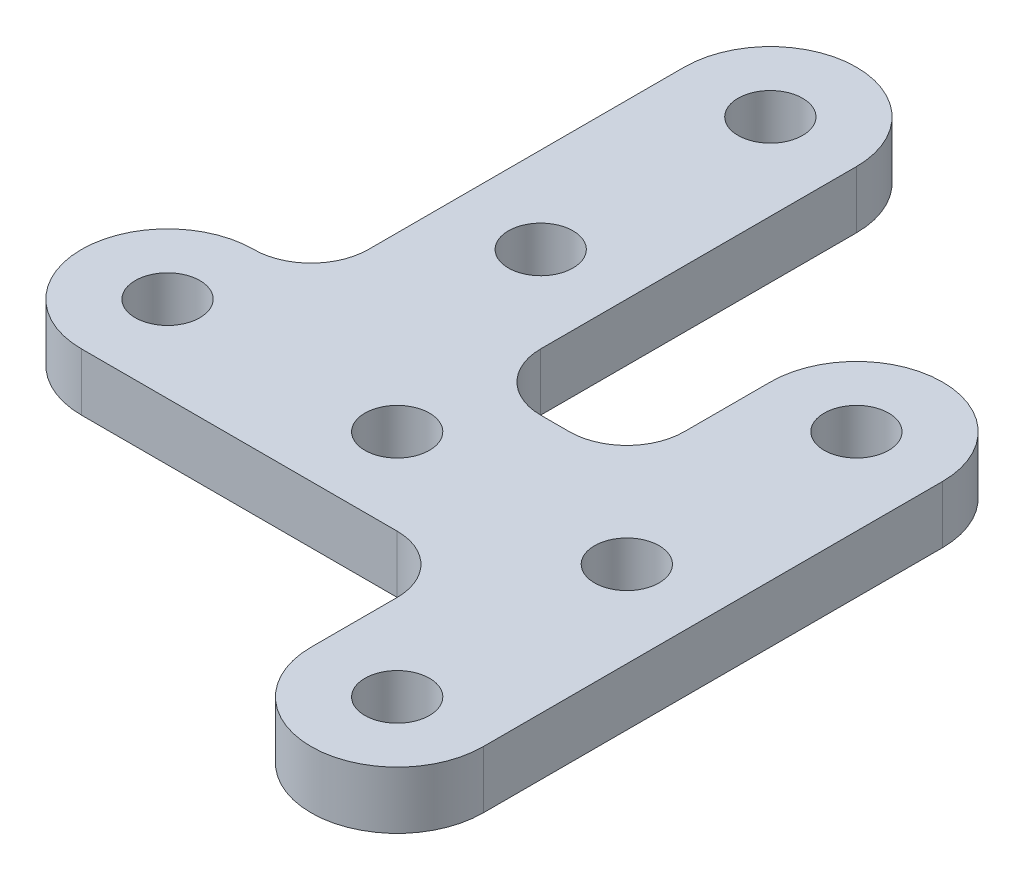
ISO-10303-21;
HEADER;
FILE_DESCRIPTION(('STEP AP214'),'2;1');
FILE_NAME('part.step','',(''),(''),'','','');
FILE_SCHEMA(('AUTOMOTIVE_DESIGN { 1 0 10303 214 1 1 1 1 }'));
ENDSEC;
DATA;
#1=APPLICATION_CONTEXT('core data for automotive mechanical design processes');
#2=APPLICATION_PROTOCOL_DEFINITION('international standard','automotive_design',2000,#1);
#3=PRODUCT_CONTEXT('',#1,'mechanical');
#4=PRODUCT('Part','Part','',(#3));
#5=PRODUCT_RELATED_PRODUCT_CATEGORY('part','',(#4));
#6=PRODUCT_DEFINITION_FORMATION('','',#4);
#7=PRODUCT_DEFINITION_CONTEXT('part definition',#1,'design');
#8=PRODUCT_DEFINITION('design','',#6,#7);
#9=PRODUCT_DEFINITION_SHAPE('','',#8);
#10=(LENGTH_UNIT() NAMED_UNIT(*) SI_UNIT(.MILLI.,.METRE.));
#11=(NAMED_UNIT(*) PLANE_ANGLE_UNIT() SI_UNIT($,.RADIAN.));
#12=(NAMED_UNIT(*) SI_UNIT($,.STERADIAN.) SOLID_ANGLE_UNIT());
#13=UNCERTAINTY_MEASURE_WITH_UNIT(LENGTH_MEASURE(1.E-05),#10,'distance_accuracy_value','');
#14=(GEOMETRIC_REPRESENTATION_CONTEXT(3) GLOBAL_UNCERTAINTY_ASSIGNED_CONTEXT((#13)) GLOBAL_UNIT_ASSIGNED_CONTEXT((#10,
#11,#12)) REPRESENTATION_CONTEXT('',''));
#15=CARTESIAN_POINT('',(0.,0.,0.));
#16=DIRECTION('',(0.,0.,1.));
#17=DIRECTION('',(1.,0.,0.));
#18=AXIS2_PLACEMENT_3D('',#15,#16,#17);
#19=CARTESIAN_POINT('',(89.566812484,125.727574554,1318.950334154));
#20=DIRECTION('',(0.,0.,1.));
#21=DIRECTION('',(1.,0.,0.));
#22=AXIS2_PLACEMENT_3D('',#19,#20,#21);
#23=PLANE('',#22);
#24=DIRECTION('',(1.,0.,0.));
#25=VECTOR('',#24,1.);
#26=CARTESIAN_POINT('',(89.566812484,132.077574554,1318.950334154));
#27=LINE('',#26,#25);
#28=CARTESIAN_POINT('',(95.9168124839999,132.077574554,1318.950334154));
#29=VERTEX_POINT('',#28);
#30=CARTESIAN_POINT('',(99.0918124839999,132.077574554,1318.950334154));
#31=VERTEX_POINT('',#30);
#32=EDGE_CURVE('E193',#29,#31,#27,.T.);
#33=ORIENTED_EDGE('',*,*,#32,.T.);
#34=DIRECTION('',(0.,1.,0.));
#35=VECTOR('',#34,1.);
#36=CARTESIAN_POINT('',(99.0918124839999,125.727574554,1318.950334154));
#37=LINE('',#36,#35);
#38=CARTESIAN_POINT('',(99.0918124839999,125.727574554,1318.950334154));
#39=VERTEX_POINT('',#38);
#40=EDGE_CURVE('E248',#31,#39,#37,.F.);
#41=ORIENTED_EDGE('',*,*,#40,.T.);
#42=DIRECTION('',(1.,0.,0.));
#43=VECTOR('',#42,1.);
#44=CARTESIAN_POINT('',(89.566812484,125.727574554,1318.950334154));
#45=LINE('',#44,#43);
#46=CARTESIAN_POINT('',(95.9168124839999,125.727574554,1318.950334154));
#47=VERTEX_POINT('',#46);
#48=EDGE_CURVE('E157',#47,#39,#45,.T.);
#49=ORIENTED_EDGE('',*,*,#48,.F.);
#50=DIRECTION('',(0.,1.,0.));
#51=VECTOR('',#50,1.);
#52=CARTESIAN_POINT('',(95.9168124839999,132.077574554,1318.950334154));
#53=LINE('',#52,#51);
#54=EDGE_CURVE('E245',#47,#29,#53,.T.);
#55=ORIENTED_EDGE('',*,*,#54,.T.);
#56=EDGE_LOOP('',(#33,#41,#49,#55));
#57=FACE_BOUND('',#56,.T.);
#58=ADVANCED_FACE('F39',(#57),#23,.F.);
#59=CARTESIAN_POINT('',(105.441812484,125.727574554,1318.950334154));
#60=DIRECTION('',(1.,0.,0.));
#61=DIRECTION('',(0.,0.,-1.));
#62=AXIS2_PLACEMENT_3D('',#59,#60,#61);
#63=PLANE('',#62);
#64=DIRECTION('',(0.,0.,-1.));
#65=VECTOR('',#64,1.);
#66=CARTESIAN_POINT('',(105.441812484,125.727574554,1318.950334154));
#67=LINE('',#66,#65);
#68=CARTESIAN_POINT('',(105.441812484,125.727574554,1312.600334154));
#69=VERTEX_POINT('',#68);
#70=CARTESIAN_POINT('',(105.441812484,125.727574554,1303.075334154));
#71=VERTEX_POINT('',#70);
#72=EDGE_CURVE('E145',#69,#71,#67,.T.);
#73=ORIENTED_EDGE('',*,*,#72,.F.);
#74=DIRECTION('',(0.,1.,0.));
#75=VECTOR('',#74,1.);
#76=CARTESIAN_POINT('',(105.441812484,132.077574554,1312.600334154));
#77=LINE('',#76,#75);
#78=CARTESIAN_POINT('',(105.441812484,132.077574554,1312.600334154));
#79=VERTEX_POINT('',#78);
#80=EDGE_CURVE('E243',#69,#79,#77,.T.);
#81=ORIENTED_EDGE('',*,*,#80,.T.);
#82=DIRECTION('',(0.,0.,-1.));
#83=VECTOR('',#82,1.);
#84=CARTESIAN_POINT('',(105.441812484,132.077574554,1318.950334154));
#85=LINE('',#84,#83);
#86=CARTESIAN_POINT('',(105.441812484,132.077574554,1303.075334154));
#87=VERTEX_POINT('',#86);
#88=EDGE_CURVE('E163',#79,#87,#85,.T.);
#89=ORIENTED_EDGE('',*,*,#88,.T.);
#90=DIRECTION('',(0.,1.,0.));
#91=VECTOR('',#90,1.);
#92=CARTESIAN_POINT('',(105.441812484,125.727574554,1303.075334154));
#93=LINE('',#92,#91);
#94=EDGE_CURVE('E160',#71,#87,#93,.T.);
#95=ORIENTED_EDGE('',*,*,#94,.F.);
#96=EDGE_LOOP('',(#73,#81,#89,#95));
#97=FACE_BOUND('',#96,.T.);
#98=ADVANCED_FACE('F161',(#97),#63,.F.);
#99=CARTESIAN_POINT('',(114.966812484,125.727574554,1303.075334154));
#100=DIRECTION('',(0.,1.,0.));
#101=DIRECTION('',(0.,0.,1.));
#102=AXIS2_PLACEMENT_3D('',#99,#100,#101);
#103=CYLINDRICAL_SURFACE('',#102,9.52500000000004);
#104=CARTESIAN_POINT('',(114.966812484,132.077574554,1303.075334154));
#105=DIRECTION('',(0.,-1.,0.));
#106=DIRECTION('',(0.,0.,-1.));
#107=AXIS2_PLACEMENT_3D('',#104,#105,#106);
#108=CIRCLE('',#107,9.52500000000004);
#109=CARTESIAN_POINT('',(124.491812484,132.077574554,1303.075334154));
#110=VERTEX_POINT('',#109);
#111=EDGE_CURVE('E198',#87,#110,#108,.T.);
#112=ORIENTED_EDGE('',*,*,#111,.T.);
#113=DIRECTION('',(0.,1.,0.));
#114=VECTOR('',#113,1.);
#115=CARTESIAN_POINT('',(124.491812484,125.727574554,1303.075334154));
#116=LINE('',#115,#114);
#117=CARTESIAN_POINT('',(124.491812484,125.727574554,1303.075334154));
#118=VERTEX_POINT('',#117);
#119=EDGE_CURVE('E167',#118,#110,#116,.T.);
#120=ORIENTED_EDGE('',*,*,#119,.F.);
#121=CARTESIAN_POINT('',(114.966812484,125.727574554,1303.075334154));
#122=DIRECTION('',(0.,-1.,0.));
#123=DIRECTION('',(0.,0.,-1.));
#124=AXIS2_PLACEMENT_3D('',#121,#122,#123);
#125=CIRCLE('',#124,9.52500000000004);
#126=EDGE_CURVE('E149',#71,#118,#125,.T.);
#127=ORIENTED_EDGE('',*,*,#126,.F.);
#128=ORIENTED_EDGE('',*,*,#94,.T.);
#129=EDGE_LOOP('',(#112,#120,#127,#128));
#130=FACE_BOUND('',#129,.T.);
#131=ADVANCED_FACE('F169',(#130),#103,.T.);
#132=CARTESIAN_POINT('',(124.491812484,125.727574554,1303.075334154));
#133=DIRECTION('',(-1.,0.,0.));
#134=DIRECTION('',(0.,0.,1.));
#135=AXIS2_PLACEMENT_3D('',#132,#133,#134);
#136=PLANE('',#135);
#137=DIRECTION('',(0.,0.,1.));
#138=VECTOR('',#137,1.);
#139=CARTESIAN_POINT('',(124.491812484,132.077574554,1303.075334154));
#140=LINE('',#139,#138);
#141=CARTESIAN_POINT('',(124.491812484,132.077574554,1353.875334154));
#142=VERTEX_POINT('',#141);
#143=EDGE_CURVE('E200',#110,#142,#140,.T.);
#144=ORIENTED_EDGE('',*,*,#143,.T.);
#145=DIRECTION('',(0.,1.,0.));
#146=VECTOR('',#145,1.);
#147=CARTESIAN_POINT('',(124.491812484,125.727574554,1353.875334154));
#148=LINE('',#147,#146);
#149=CARTESIAN_POINT('',(124.491812484,125.727574554,1353.875334154));
#150=VERTEX_POINT('',#149);
#151=EDGE_CURVE('E232',#150,#142,#148,.T.);
#152=ORIENTED_EDGE('',*,*,#151,.F.);
#153=DIRECTION('',(0.,0.,1.));
#154=VECTOR('',#153,1.);
#155=CARTESIAN_POINT('',(124.491812484,125.727574554,1303.075334154));
#156=LINE('',#155,#154);
#157=EDGE_CURVE('E172',#118,#150,#156,.T.);
#158=ORIENTED_EDGE('',*,*,#157,.F.);
#159=ORIENTED_EDGE('',*,*,#119,.T.);
#160=EDGE_LOOP('',(#144,#152,#158,#159));
#161=FACE_BOUND('',#160,.T.);
#162=ADVANCED_FACE('F335',(#161),#136,.F.);
#163=CARTESIAN_POINT('',(114.966812484,125.727574554,1353.875334154));
#164=DIRECTION('',(0.,1.,0.));
#165=DIRECTION('',(0.,0.,1.));
#166=AXIS2_PLACEMENT_3D('',#163,#164,#165);
#167=CYLINDRICAL_SURFACE('',#166,9.52500000000003);
#168=CARTESIAN_POINT('',(114.966812484,132.077574554,1353.875334154));
#169=DIRECTION('',(0.,-1.,0.));
#170=DIRECTION('',(0.,0.,-1.));
#171=AXIS2_PLACEMENT_3D('',#168,#169,#170);
#172=CIRCLE('',#171,9.52500000000003);
#173=CARTESIAN_POINT('',(105.441812484,132.077574554,1353.875334154));
#174=VERTEX_POINT('',#173);
#175=EDGE_CURVE('E202',#142,#174,#172,.T.);
#176=ORIENTED_EDGE('',*,*,#175,.T.);
#177=DIRECTION('',(0.,1.,0.));
#178=VECTOR('',#177,1.);
#179=CARTESIAN_POINT('',(105.441812484,125.727574554,1353.875334154));
#180=LINE('',#179,#178);
#181=CARTESIAN_POINT('',(105.441812484,125.727574554,1353.875334154));
#182=VERTEX_POINT('',#181);
#183=EDGE_CURVE('E229',#182,#174,#180,.T.);
#184=ORIENTED_EDGE('',*,*,#183,.F.);
#185=CARTESIAN_POINT('',(114.966812484,125.727574554,1353.875334154));
#186=DIRECTION('',(0.,-1.,0.));
#187=DIRECTION('',(0.,0.,-1.));
#188=AXIS2_PLACEMENT_3D('',#185,#186,#187);
#189=CIRCLE('',#188,9.52500000000003);
#190=EDGE_CURVE('E174',#150,#182,#189,.T.);
#191=ORIENTED_EDGE('',*,*,#190,.F.);
#192=ORIENTED_EDGE('',*,*,#151,.T.);
#193=EDGE_LOOP('',(#176,#184,#191,#192));
#194=FACE_BOUND('',#193,.T.);
#195=ADVANCED_FACE('F332',(#194),#167,.T.);
#196=CARTESIAN_POINT('',(105.441812484,125.727574554,1338.000334154));
#197=DIRECTION('',(1.,0.,0.));
#198=DIRECTION('',(0.,0.,-1.));
#199=AXIS2_PLACEMENT_3D('',#196,#197,#198);
#200=PLANE('',#199);
#201=DIRECTION('',(0.,0.,-1.));
#202=VECTOR('',#201,1.);
#203=CARTESIAN_POINT('',(105.441812484,132.077574554,1338.000334154));
#204=LINE('',#203,#202);
#205=CARTESIAN_POINT('',(105.441812484,132.077574554,1344.350334154));
#206=VERTEX_POINT('',#205);
#207=EDGE_CURVE('E204',#174,#206,#204,.T.);
#208=ORIENTED_EDGE('',*,*,#207,.T.);
#209=DIRECTION('',(0.,1.,0.));
#210=VECTOR('',#209,1.);
#211=CARTESIAN_POINT('',(105.441812484,125.727574554,1344.350334154));
#212=LINE('',#211,#210);
#213=CARTESIAN_POINT('',(105.441812484,125.727574554,1344.350334154));
#214=VERTEX_POINT('',#213);
#215=EDGE_CURVE('E241',#206,#214,#212,.F.);
#216=ORIENTED_EDGE('',*,*,#215,.T.);
#217=DIRECTION('',(0.,0.,-1.));
#218=VECTOR('',#217,1.);
#219=CARTESIAN_POINT('',(105.441812484,125.727574554,1338.000334154));
#220=LINE('',#219,#218);
#221=EDGE_CURVE('E179',#182,#214,#220,.T.);
#222=ORIENTED_EDGE('',*,*,#221,.F.);
#223=ORIENTED_EDGE('',*,*,#183,.T.);
#224=EDGE_LOOP('',(#208,#216,#222,#223));
#225=FACE_BOUND('',#224,.T.);
#226=ADVANCED_FACE('F325',(#225),#200,.F.);
#227=CARTESIAN_POINT('',(64.1668124839999,125.727574554,1338.000334154));
#228=DIRECTION('',(0.,0.,-1.));
#229=DIRECTION('',(-1.,0.,0.));
#230=AXIS2_PLACEMENT_3D('',#227,#228,#229);
#231=PLANE('',#230);
#232=DIRECTION('',(-1.,0.,0.));
#233=VECTOR('',#232,1.);
#234=CARTESIAN_POINT('',(64.1668124839999,125.727574554,1338.000334154));
#235=LINE('',#234,#233);
#236=CARTESIAN_POINT('',(99.0918124839999,125.727574554,1338.000334154));
#237=VERTEX_POINT('',#236);
#238=CARTESIAN_POINT('',(64.1668124839999,125.727574554,1338.000334154));
#239=VERTEX_POINT('',#238);
#240=EDGE_CURVE('E182',#237,#239,#235,.T.);
#241=ORIENTED_EDGE('',*,*,#240,.F.);
#242=DIRECTION('',(0.,1.,0.));
#243=VECTOR('',#242,1.);
#244=CARTESIAN_POINT('',(99.0918124839999,132.077574554,1338.000334154));
#245=LINE('',#244,#243);
#246=CARTESIAN_POINT('',(99.0918124839999,132.077574554,1338.000334154));
#247=VERTEX_POINT('',#246);
#248=EDGE_CURVE('E238',#237,#247,#245,.T.);
#249=ORIENTED_EDGE('',*,*,#248,.T.);
#250=DIRECTION('',(-1.,0.,0.));
#251=VECTOR('',#250,1.);
#252=CARTESIAN_POINT('',(64.1668124839999,132.077574554,1338.000334154));
#253=LINE('',#252,#251);
#254=CARTESIAN_POINT('',(64.1668124839999,132.077574554,1338.000334154));
#255=VERTEX_POINT('',#254);
#256=EDGE_CURVE('E207',#247,#255,#253,.T.);
#257=ORIENTED_EDGE('',*,*,#256,.T.);
#258=DIRECTION('',(0.,1.,0.));
#259=VECTOR('',#258,1.);
#260=CARTESIAN_POINT('',(64.1668124839999,125.727574554,1338.000334154));
#261=LINE('',#260,#259);
#262=EDGE_CURVE('E226',#239,#255,#261,.T.);
#263=ORIENTED_EDGE('',*,*,#262,.F.);
#264=EDGE_LOOP('',(#241,#249,#257,#263));
#265=FACE_BOUND('',#264,.T.);
#266=ADVANCED_FACE('F319',(#265),#231,.F.);
#267=CARTESIAN_POINT('',(64.1668124839999,125.727574554,1328.475334154));
#268=DIRECTION('',(0.,1.,0.));
#269=DIRECTION('',(0.,0.,1.));
#270=AXIS2_PLACEMENT_3D('',#267,#268,#269);
#271=CYLINDRICAL_SURFACE('',#270,9.52500000000001);
#272=CARTESIAN_POINT('',(64.1668124839999,132.077574554,1328.475334154));
#273=DIRECTION('',(0.,-1.,0.));
#274=DIRECTION('',(0.,0.,-1.));
#275=AXIS2_PLACEMENT_3D('',#272,#273,#274);
#276=CIRCLE('',#275,9.52500000000001);
#277=CARTESIAN_POINT('',(64.1668124839999,132.077574554,1318.950334154));
#278=VERTEX_POINT('',#277);
#279=EDGE_CURVE('E209',#255,#278,#276,.T.);
#280=ORIENTED_EDGE('',*,*,#279,.T.);
#281=DIRECTION('',(0.,1.,0.));
#282=VECTOR('',#281,1.);
#283=CARTESIAN_POINT('',(64.1668124839999,125.727574554,1318.950334154));
#284=LINE('',#283,#282);
#285=CARTESIAN_POINT('',(64.1668124839999,125.727574554,1318.950334154));
#286=VERTEX_POINT('',#285);
#287=EDGE_CURVE('E223',#286,#278,#284,.T.);
#288=ORIENTED_EDGE('',*,*,#287,.F.);
#289=CARTESIAN_POINT('',(64.1668124839999,125.727574554,1328.475334154));
#290=DIRECTION('',(0.,-1.,0.));
#291=DIRECTION('',(0.,0.,-1.));
#292=AXIS2_PLACEMENT_3D('',#289,#290,#291);
#293=CIRCLE('',#292,9.52500000000001);
#294=EDGE_CURVE('E184',#239,#286,#293,.T.);
#295=ORIENTED_EDGE('',*,*,#294,.F.);
#296=ORIENTED_EDGE('',*,*,#262,.T.);
#297=EDGE_LOOP('',(#280,#288,#295,#296));
#298=FACE_BOUND('',#297,.T.);
#299=ADVANCED_FACE('F315',(#298),#271,.T.);
#300=CARTESIAN_POINT('',(70.5168124839999,125.727574554,1318.950334154));
#301=DIRECTION('',(1.,0.,0.));
#302=DIRECTION('',(0.,0.,-1.));
#303=AXIS2_PLACEMENT_3D('',#300,#301,#302);
#304=PLANE('',#303);
#305=DIRECTION('',(0.,0.,-1.));
#306=VECTOR('',#305,1.);
#307=CARTESIAN_POINT('',(70.5168124839999,125.727574554,1318.950334154));
#308=LINE('',#307,#306);
#309=CARTESIAN_POINT('',(70.5168124839999,125.727574554,1312.600334154));
#310=VERTEX_POINT('',#309);
#311=CARTESIAN_POINT('',(70.5168124839999,125.727574554,1277.675334154));
#312=VERTEX_POINT('',#311);
#313=EDGE_CURVE('E186',#310,#312,#308,.T.);
#314=ORIENTED_EDGE('',*,*,#313,.F.);
#315=DIRECTION('',(0.,1.,0.));
#316=VECTOR('',#315,1.);
#317=CARTESIAN_POINT('',(70.5168124839999,132.077574554,1312.600334154));
#318=LINE('',#317,#316);
#319=CARTESIAN_POINT('',(70.5168124839999,132.077574554,1312.600334154));
#320=VERTEX_POINT('',#319);
#321=EDGE_CURVE('E166',#310,#320,#318,.T.);
#322=ORIENTED_EDGE('',*,*,#321,.T.);
#323=DIRECTION('',(0.,0.,-1.));
#324=VECTOR('',#323,1.);
#325=CARTESIAN_POINT('',(70.5168124839999,132.077574554,1318.950334154));
#326=LINE('',#325,#324);
#327=CARTESIAN_POINT('',(70.5168124839999,132.077574554,1277.675334154));
#328=VERTEX_POINT('',#327);
#329=EDGE_CURVE('E212',#320,#328,#326,.T.);
#330=ORIENTED_EDGE('',*,*,#329,.T.);
#331=DIRECTION('',(0.,1.,0.));
#332=VECTOR('',#331,1.);
#333=CARTESIAN_POINT('',(70.5168124839999,125.727574554,1277.675334154));
#334=LINE('',#333,#332);
#335=EDGE_CURVE('E220',#312,#328,#334,.T.);
#336=ORIENTED_EDGE('',*,*,#335,.F.);
#337=EDGE_LOOP('',(#314,#322,#330,#336));
#338=FACE_BOUND('',#337,.T.);
#339=ADVANCED_FACE('F303',(#338),#304,.F.);
#340=CARTESIAN_POINT('',(80.041812484,125.727574554,1277.675334154));
#341=DIRECTION('',(0.,1.,0.));
#342=DIRECTION('',(0.,0.,1.));
#343=AXIS2_PLACEMENT_3D('',#340,#341,#342);
#344=CYLINDRICAL_SURFACE('',#343,9.52500000000003);
#345=CARTESIAN_POINT('',(80.041812484,132.077574554,1277.675334154));
#346=DIRECTION('',(0.,-1.,0.));
#347=DIRECTION('',(0.,0.,-1.));
#348=AXIS2_PLACEMENT_3D('',#345,#346,#347);
#349=CIRCLE('',#348,9.52500000000003);
#350=CARTESIAN_POINT('',(89.566812484,132.077574554,1277.675334154));
#351=VERTEX_POINT('',#350);
#352=EDGE_CURVE('E214',#328,#351,#349,.T.);
#353=ORIENTED_EDGE('',*,*,#352,.T.);
#354=DIRECTION('',(0.,1.,0.));
#355=VECTOR('',#354,1.);
#356=CARTESIAN_POINT('',(89.566812484,125.727574554,1277.675334154));
#357=LINE('',#356,#355);
#358=CARTESIAN_POINT('',(89.566812484,125.727574554,1277.675334154));
#359=VERTEX_POINT('',#358);
#360=EDGE_CURVE('E192',#359,#351,#357,.T.);
#361=ORIENTED_EDGE('',*,*,#360,.F.);
#362=CARTESIAN_POINT('',(80.041812484,125.727574554,1277.675334154));
#363=DIRECTION('',(0.,-1.,0.));
#364=DIRECTION('',(0.,0.,-1.));
#365=AXIS2_PLACEMENT_3D('',#362,#363,#364);
#366=CIRCLE('',#365,9.52500000000003);
#367=EDGE_CURVE('E188',#312,#359,#366,.T.);
#368=ORIENTED_EDGE('',*,*,#367,.F.);
#369=ORIENTED_EDGE('',*,*,#335,.T.);
#370=EDGE_LOOP('',(#353,#361,#368,#369));
#371=FACE_BOUND('',#370,.T.);
#372=ADVANCED_FACE('F309',(#371),#344,.T.);
#373=CARTESIAN_POINT('',(89.566812484,125.727574554,1277.675334154));
#374=DIRECTION('',(-1.,0.,0.));
#375=DIRECTION('',(0.,0.,1.));
#376=AXIS2_PLACEMENT_3D('',#373,#374,#375);
#377=PLANE('',#376);
#378=DIRECTION('',(0.,0.,1.));
#379=VECTOR('',#378,1.);
#380=CARTESIAN_POINT('',(89.566812484,132.077574554,1277.675334154));
#381=LINE('',#380,#379);
#382=CARTESIAN_POINT('',(89.566812484,132.077574554,1312.600334154));
#383=VERTEX_POINT('',#382);
#384=EDGE_CURVE('E216',#351,#383,#381,.T.);
#385=ORIENTED_EDGE('',*,*,#384,.T.);
#386=DIRECTION('',(0.,1.,0.));
#387=VECTOR('',#386,1.);
#388=CARTESIAN_POINT('',(89.566812484,125.727574554,1312.600334154));
#389=LINE('',#388,#387);
#390=CARTESIAN_POINT('',(89.566812484,125.727574554,1312.600334154));
#391=VERTEX_POINT('',#390);
#392=EDGE_CURVE('E54',#383,#391,#389,.F.);
#393=ORIENTED_EDGE('',*,*,#392,.T.);
#394=DIRECTION('',(0.,0.,1.));
#395=VECTOR('',#394,1.);
#396=CARTESIAN_POINT('',(89.566812484,125.727574554,1277.675334154));
#397=LINE('',#396,#395);
#398=EDGE_CURVE('E190',#359,#391,#397,.T.);
#399=ORIENTED_EDGE('',*,*,#398,.F.);
#400=ORIENTED_EDGE('',*,*,#360,.T.);
#401=EDGE_LOOP('',(#385,#393,#399,#400));
#402=FACE_BOUND('',#401,.T.);
#403=ADVANCED_FACE('F311',(#402),#377,.F.);
#404=CARTESIAN_POINT('',(114.966812484,125.727574554,1303.075334154));
#405=DIRECTION('',(0.,-1.,0.));
#406=DIRECTION('',(0.,0.,-1.));
#407=AXIS2_PLACEMENT_3D('',#404,#405,#406);
#408=PLANE('',#407);
#409=CARTESIAN_POINT('',(114.966812484,125.727574554,1353.875334154));
#410=DIRECTION('',(0.,-1.,0.));
#411=DIRECTION('',(0.,0.,-1.));
#412=AXIS2_PLACEMENT_3D('',#409,#410,#411);
#413=CIRCLE('',#412,3.57123999999999);
#414=CARTESIAN_POINT('',(114.966812484,125.727574554,1350.304094154));
#415=VERTEX_POINT('',#414);
#416=EDGE_CURVE('E398',#415,#415,#413,.T.);
#417=ORIENTED_EDGE('',*,*,#416,.F.);
#418=EDGE_LOOP('',(#417));
#419=FACE_BOUND('',#418,.T.);
#420=CARTESIAN_POINT('',(114.966812484,125.727574554,1303.075334154));
#421=DIRECTION('',(0.,-1.,0.));
#422=DIRECTION('',(0.,0.,-1.));
#423=AXIS2_PLACEMENT_3D('',#420,#421,#422);
#424=CIRCLE('',#423,3.57123999999999);
#425=CARTESIAN_POINT('',(114.966812484,125.727574554,1299.504094154));
#426=VERTEX_POINT('',#425);
#427=EDGE_CURVE('E391',#426,#426,#424,.T.);
#428=ORIENTED_EDGE('',*,*,#427,.F.);
#429=EDGE_LOOP('',(#428));
#430=FACE_BOUND('',#429,.T.);
#431=CARTESIAN_POINT('',(64.1668124839999,125.727574554,1328.475334154));
#432=DIRECTION('',(0.,-1.,0.));
#433=DIRECTION('',(0.,0.,-1.));
#434=AXIS2_PLACEMENT_3D('',#431,#432,#433);
#435=CIRCLE('',#434,3.57123999999999);
#436=CARTESIAN_POINT('',(64.1668124839999,125.727574554,1324.904094154));
#437=VERTEX_POINT('',#436);
#438=EDGE_CURVE('E395',#437,#437,#435,.T.);
#439=ORIENTED_EDGE('',*,*,#438,.F.);
#440=EDGE_LOOP('',(#439));
#441=FACE_BOUND('',#440,.T.);
#442=CARTESIAN_POINT('',(80.041812484,125.727574554,1277.675334154));
#443=DIRECTION('',(0.,-1.,0.));
#444=DIRECTION('',(0.,0.,-1.));
#445=AXIS2_PLACEMENT_3D('',#442,#443,#444);
#446=CIRCLE('',#445,3.57123999999999);
#447=CARTESIAN_POINT('',(80.041812484,125.727574554,1274.104094154));
#448=VERTEX_POINT('',#447);
#449=EDGE_CURVE('E407',#448,#448,#446,.T.);
#450=ORIENTED_EDGE('',*,*,#449,.F.);
#451=EDGE_LOOP('',(#450));
#452=FACE_BOUND('',#451,.T.);
#453=CARTESIAN_POINT('',(80.041812484,125.727574554,1303.075334154));
#454=DIRECTION('',(0.,-1.,0.));
#455=DIRECTION('',(0.,0.,-1.));
#456=AXIS2_PLACEMENT_3D('',#453,#454,#455);
#457=CIRCLE('',#456,3.57123999999999);
#458=CARTESIAN_POINT('',(80.041812484,125.727574554,1299.504094154));
#459=VERTEX_POINT('',#458);
#460=EDGE_CURVE('E413',#459,#459,#457,.T.);
#461=ORIENTED_EDGE('',*,*,#460,.F.);
#462=EDGE_LOOP('',(#461));
#463=FACE_BOUND('',#462,.T.);
#464=CARTESIAN_POINT('',(89.566812484,125.727574554,1328.475334154));
#465=DIRECTION('',(0.,-1.,0.));
#466=DIRECTION('',(0.,0.,-1.));
#467=AXIS2_PLACEMENT_3D('',#464,#465,#466);
#468=CIRCLE('',#467,3.57123999999999);
#469=CARTESIAN_POINT('',(89.566812484,125.727574554,1324.904094154));
#470=VERTEX_POINT('',#469);
#471=EDGE_CURVE('E419',#470,#470,#468,.T.);
#472=ORIENTED_EDGE('',*,*,#471,.F.);
#473=EDGE_LOOP('',(#472));
#474=FACE_BOUND('',#473,.T.);
#475=CARTESIAN_POINT('',(114.966812484,125.727574554,1328.475334154));
#476=DIRECTION('',(0.,-1.,0.));
#477=DIRECTION('',(0.,0.,-1.));
#478=AXIS2_PLACEMENT_3D('',#475,#476,#477);
#479=CIRCLE('',#478,3.57123999999999);
#480=CARTESIAN_POINT('',(114.966812484,125.727574554,1324.904094154));
#481=VERTEX_POINT('',#480);
#482=EDGE_CURVE('E425',#481,#481,#479,.T.);
#483=ORIENTED_EDGE('',*,*,#482,.F.);
#484=EDGE_LOOP('',(#483));
#485=FACE_BOUND('',#484,.T.);
#486=ORIENTED_EDGE('',*,*,#398,.T.);
#487=CARTESIAN_POINT('',(95.9168124839999,125.727574554,1312.600334154));
#488=DIRECTION('',(0.,-1.,0.));
#489=DIRECTION('',(0.,0.,-1.));
#490=AXIS2_PLACEMENT_3D('',#487,#488,#489);
#491=CIRCLE('',#490,6.35);
#492=EDGE_CURVE('E11',#391,#47,#491,.F.);
#493=ORIENTED_EDGE('',*,*,#492,.T.);
#494=ORIENTED_EDGE('',*,*,#48,.T.);
#495=CARTESIAN_POINT('',(99.0918124839999,125.727574554,1312.600334154));
#496=DIRECTION('',(0.,-1.,0.));
#497=DIRECTION('',(0.,0.,-1.));
#498=AXIS2_PLACEMENT_3D('',#495,#496,#497);
#499=CIRCLE('',#498,6.35);
#500=EDGE_CURVE('E153',#39,#69,#499,.F.);
#501=ORIENTED_EDGE('',*,*,#500,.T.);
#502=ORIENTED_EDGE('',*,*,#72,.T.);
#503=ORIENTED_EDGE('',*,*,#126,.T.);
#504=ORIENTED_EDGE('',*,*,#157,.T.);
#505=ORIENTED_EDGE('',*,*,#190,.T.);
#506=ORIENTED_EDGE('',*,*,#221,.T.);
#507=CARTESIAN_POINT('',(99.0918124839999,125.727574554,1344.350334154));
#508=DIRECTION('',(0.,-1.,0.));
#509=DIRECTION('',(0.,0.,-1.));
#510=AXIS2_PLACEMENT_3D('',#507,#508,#509);
#511=CIRCLE('',#510,6.35);
#512=EDGE_CURVE('E257',#214,#237,#511,.F.);
#513=ORIENTED_EDGE('',*,*,#512,.T.);
#514=ORIENTED_EDGE('',*,*,#240,.T.);
#515=ORIENTED_EDGE('',*,*,#294,.T.);
#516=CARTESIAN_POINT('',(64.1668124839999,125.727574554,1312.600334154));
#517=DIRECTION('',(0.,-1.,0.));
#518=DIRECTION('',(0.,0.,-1.));
#519=AXIS2_PLACEMENT_3D('',#516,#517,#518);
#520=CIRCLE('',#519,6.35);
#521=EDGE_CURVE('E253',#286,#310,#520,.F.);
#522=ORIENTED_EDGE('',*,*,#521,.T.);
#523=ORIENTED_EDGE('',*,*,#313,.T.);
#524=ORIENTED_EDGE('',*,*,#367,.T.);
#525=EDGE_LOOP('',(#486,#493,#494,#501,#502,#503,#504,#505,#506,#513,#514,#515,#522,#523,#524));
#526=FACE_BOUND('',#525,.T.);
#527=ADVANCED_FACE('F147',(#419,#430,#441,#452,#463,#474,#485,#526),#408,.T.);
#528=CARTESIAN_POINT('',(114.966812484,132.077574554,1303.075334154));
#529=DIRECTION('',(0.,-1.,0.));
#530=DIRECTION('',(0.,0.,-1.));
#531=AXIS2_PLACEMENT_3D('',#528,#529,#530);
#532=PLANE('',#531);
#533=CARTESIAN_POINT('',(114.966812484,132.077574554,1353.875334154));
#534=DIRECTION('',(0.,-1.,0.));
#535=DIRECTION('',(0.,0.,-1.));
#536=AXIS2_PLACEMENT_3D('',#533,#534,#535);
#537=CIRCLE('',#536,3.57124);
#538=CARTESIAN_POINT('',(114.966812484,132.077574554,1350.304094154));
#539=VERTEX_POINT('',#538);
#540=EDGE_CURVE('E393',#539,#539,#537,.T.);
#541=ORIENTED_EDGE('',*,*,#540,.T.);
#542=EDGE_LOOP('',(#541));
#543=FACE_BOUND('',#542,.T.);
#544=CARTESIAN_POINT('',(114.966812484,132.077574554,1303.075334154));
#545=DIRECTION('',(0.,-1.,0.));
#546=DIRECTION('',(0.,0.,-1.));
#547=AXIS2_PLACEMENT_3D('',#544,#545,#546);
#548=CIRCLE('',#547,3.57124);
#549=CARTESIAN_POINT('',(114.966812484,132.077574554,1299.504094154));
#550=VERTEX_POINT('',#549);
#551=EDGE_CURVE('E388',#550,#550,#548,.T.);
#552=ORIENTED_EDGE('',*,*,#551,.T.);
#553=EDGE_LOOP('',(#552));
#554=FACE_BOUND('',#553,.T.);
#555=CARTESIAN_POINT('',(64.1668124839999,132.077574554,1328.475334154));
#556=DIRECTION('',(0.,-1.,0.));
#557=DIRECTION('',(0.,0.,-1.));
#558=AXIS2_PLACEMENT_3D('',#555,#556,#557);
#559=CIRCLE('',#558,3.57124);
#560=CARTESIAN_POINT('',(64.1668124839999,132.077574554,1324.904094154));
#561=VERTEX_POINT('',#560);
#562=EDGE_CURVE('E404',#561,#561,#559,.T.);
#563=ORIENTED_EDGE('',*,*,#562,.T.);
#564=EDGE_LOOP('',(#563));
#565=FACE_BOUND('',#564,.T.);
#566=CARTESIAN_POINT('',(80.041812484,132.077574554,1277.675334154));
#567=DIRECTION('',(0.,-1.,0.));
#568=DIRECTION('',(0.,0.,-1.));
#569=AXIS2_PLACEMENT_3D('',#566,#567,#568);
#570=CIRCLE('',#569,3.57124);
#571=CARTESIAN_POINT('',(80.041812484,132.077574554,1274.104094154));
#572=VERTEX_POINT('',#571);
#573=EDGE_CURVE('E410',#572,#572,#570,.T.);
#574=ORIENTED_EDGE('',*,*,#573,.T.);
#575=EDGE_LOOP('',(#574));
#576=FACE_BOUND('',#575,.T.);
#577=CARTESIAN_POINT('',(80.041812484,132.077574554,1303.075334154));
#578=DIRECTION('',(0.,-1.,0.));
#579=DIRECTION('',(0.,0.,-1.));
#580=AXIS2_PLACEMENT_3D('',#577,#578,#579);
#581=CIRCLE('',#580,3.57124);
#582=CARTESIAN_POINT('',(80.041812484,132.077574554,1299.504094154));
#583=VERTEX_POINT('',#582);
#584=EDGE_CURVE('E416',#583,#583,#581,.T.);
#585=ORIENTED_EDGE('',*,*,#584,.T.);
#586=EDGE_LOOP('',(#585));
#587=FACE_BOUND('',#586,.T.);
#588=CARTESIAN_POINT('',(89.566812484,132.077574554,1328.475334154));
#589=DIRECTION('',(0.,-1.,0.));
#590=DIRECTION('',(0.,0.,-1.));
#591=AXIS2_PLACEMENT_3D('',#588,#589,#590);
#592=CIRCLE('',#591,3.57124);
#593=CARTESIAN_POINT('',(89.566812484,132.077574554,1324.904094154));
#594=VERTEX_POINT('',#593);
#595=EDGE_CURVE('E422',#594,#594,#592,.T.);
#596=ORIENTED_EDGE('',*,*,#595,.T.);
#597=EDGE_LOOP('',(#596));
#598=FACE_BOUND('',#597,.T.);
#599=CARTESIAN_POINT('',(114.966812484,132.077574554,1328.475334154));
#600=DIRECTION('',(0.,-1.,0.));
#601=DIRECTION('',(0.,0.,-1.));
#602=AXIS2_PLACEMENT_3D('',#599,#600,#601);
#603=CIRCLE('',#602,3.57124);
#604=CARTESIAN_POINT('',(114.966812484,132.077574554,1324.904094154));
#605=VERTEX_POINT('',#604);
#606=EDGE_CURVE('E196',#605,#605,#603,.T.);
#607=ORIENTED_EDGE('',*,*,#606,.T.);
#608=EDGE_LOOP('',(#607));
#609=FACE_BOUND('',#608,.T.);
#610=ORIENTED_EDGE('',*,*,#32,.F.);
#611=CARTESIAN_POINT('',(95.9168124839999,132.077574554,1312.600334154));
#612=DIRECTION('',(0.,-1.,0.));
#613=DIRECTION('',(0.,0.,-1.));
#614=AXIS2_PLACEMENT_3D('',#611,#612,#613);
#615=CIRCLE('',#614,6.35);
#616=EDGE_CURVE('E47',#29,#383,#615,.T.);
#617=ORIENTED_EDGE('',*,*,#616,.T.);
#618=ORIENTED_EDGE('',*,*,#384,.F.);
#619=ORIENTED_EDGE('',*,*,#352,.F.);
#620=ORIENTED_EDGE('',*,*,#329,.F.);
#621=CARTESIAN_POINT('',(64.1668124839999,132.077574554,1312.600334154));
#622=DIRECTION('',(0.,-1.,0.));
#623=DIRECTION('',(0.,0.,-1.));
#624=AXIS2_PLACEMENT_3D('',#621,#622,#623);
#625=CIRCLE('',#624,6.35);
#626=EDGE_CURVE('E251',#320,#278,#625,.T.);
#627=ORIENTED_EDGE('',*,*,#626,.T.);
#628=ORIENTED_EDGE('',*,*,#279,.F.);
#629=ORIENTED_EDGE('',*,*,#256,.F.);
#630=CARTESIAN_POINT('',(99.0918124839999,132.077574554,1344.350334154));
#631=DIRECTION('',(0.,-1.,0.));
#632=DIRECTION('',(0.,0.,-1.));
#633=AXIS2_PLACEMENT_3D('',#630,#631,#632);
#634=CIRCLE('',#633,6.35);
#635=EDGE_CURVE('E255',#247,#206,#634,.T.);
#636=ORIENTED_EDGE('',*,*,#635,.T.);
#637=ORIENTED_EDGE('',*,*,#207,.F.);
#638=ORIENTED_EDGE('',*,*,#175,.F.);
#639=ORIENTED_EDGE('',*,*,#143,.F.);
#640=ORIENTED_EDGE('',*,*,#111,.F.);
#641=ORIENTED_EDGE('',*,*,#88,.F.);
#642=CARTESIAN_POINT('',(99.0918124839999,132.077574554,1312.600334154));
#643=DIRECTION('',(0.,-1.,0.));
#644=DIRECTION('',(0.,0.,-1.));
#645=AXIS2_PLACEMENT_3D('',#642,#643,#644);
#646=CIRCLE('',#645,6.35);
#647=EDGE_CURVE('E259',#79,#31,#646,.T.);
#648=ORIENTED_EDGE('',*,*,#647,.T.);
#649=EDGE_LOOP('',(#610,#617,#618,#619,#620,#627,#628,#629,#636,#637,#638,#639,#640,#641,#648));
#650=FACE_BOUND('',#649,.T.);
#651=ADVANCED_FACE('F261',(#543,#554,#565,#576,#587,#598,#609,#650),#532,.F.);
#652=CARTESIAN_POINT('',(114.966812484,125.727574554,1328.475334154));
#653=DIRECTION('',(0.,-1.,0.));
#654=DIRECTION('',(0.,0.,-1.));
#655=AXIS2_PLACEMENT_3D('',#652,#653,#654);
#656=CYLINDRICAL_SURFACE('',#655,3.57124);
#657=ORIENTED_EDGE('',*,*,#606,.F.);
#658=EDGE_LOOP('',(#657));
#659=FACE_BOUND('',#658,.T.);
#660=ORIENTED_EDGE('',*,*,#482,.T.);
#661=EDGE_LOOP('',(#660));
#662=FACE_BOUND('',#661,.T.);
#663=ADVANCED_FACE('F357',(#659,#662),#656,.F.);
#664=CARTESIAN_POINT('',(89.566812484,125.727574554,1328.475334154));
#665=DIRECTION('',(0.,-1.,0.));
#666=DIRECTION('',(0.,0.,-1.));
#667=AXIS2_PLACEMENT_3D('',#664,#665,#666);
#668=CYLINDRICAL_SURFACE('',#667,3.57124);
#669=ORIENTED_EDGE('',*,*,#595,.F.);
#670=EDGE_LOOP('',(#669));
#671=FACE_BOUND('',#670,.T.);
#672=ORIENTED_EDGE('',*,*,#471,.T.);
#673=EDGE_LOOP('',(#672));
#674=FACE_BOUND('',#673,.T.);
#675=ADVANCED_FACE('F364',(#671,#674),#668,.F.);
#676=CARTESIAN_POINT('',(80.041812484,125.727574554,1303.075334154));
#677=DIRECTION('',(0.,-1.,0.));
#678=DIRECTION('',(0.,0.,-1.));
#679=AXIS2_PLACEMENT_3D('',#676,#677,#678);
#680=CYLINDRICAL_SURFACE('',#679,3.57124);
#681=ORIENTED_EDGE('',*,*,#584,.F.);
#682=EDGE_LOOP('',(#681));
#683=FACE_BOUND('',#682,.T.);
#684=ORIENTED_EDGE('',*,*,#460,.T.);
#685=EDGE_LOOP('',(#684));
#686=FACE_BOUND('',#685,.T.);
#687=ADVANCED_FACE('F368',(#683,#686),#680,.F.);
#688=CARTESIAN_POINT('',(80.041812484,125.727574554,1277.675334154));
#689=DIRECTION('',(0.,-1.,0.));
#690=DIRECTION('',(0.,0.,-1.));
#691=AXIS2_PLACEMENT_3D('',#688,#689,#690);
#692=CYLINDRICAL_SURFACE('',#691,3.57124);
#693=ORIENTED_EDGE('',*,*,#573,.F.);
#694=EDGE_LOOP('',(#693));
#695=FACE_BOUND('',#694,.T.);
#696=ORIENTED_EDGE('',*,*,#449,.T.);
#697=EDGE_LOOP('',(#696));
#698=FACE_BOUND('',#697,.T.);
#699=ADVANCED_FACE('F372',(#695,#698),#692,.F.);
#700=CARTESIAN_POINT('',(64.1668124839999,125.727574554,1328.475334154));
#701=DIRECTION('',(0.,-1.,0.));
#702=DIRECTION('',(0.,0.,-1.));
#703=AXIS2_PLACEMENT_3D('',#700,#701,#702);
#704=CYLINDRICAL_SURFACE('',#703,3.57124);
#705=ORIENTED_EDGE('',*,*,#562,.F.);
#706=EDGE_LOOP('',(#705));
#707=FACE_BOUND('',#706,.T.);
#708=ORIENTED_EDGE('',*,*,#438,.T.);
#709=EDGE_LOOP('',(#708));
#710=FACE_BOUND('',#709,.T.);
#711=ADVANCED_FACE('F376',(#707,#710),#704,.F.);
#712=CARTESIAN_POINT('',(114.966812484,125.727574554,1303.075334154));
#713=DIRECTION('',(0.,-1.,0.));
#714=DIRECTION('',(0.,0.,-1.));
#715=AXIS2_PLACEMENT_3D('',#712,#713,#714);
#716=CYLINDRICAL_SURFACE('',#715,3.57124);
#717=ORIENTED_EDGE('',*,*,#551,.F.);
#718=EDGE_LOOP('',(#717));
#719=FACE_BOUND('',#718,.T.);
#720=ORIENTED_EDGE('',*,*,#427,.T.);
#721=EDGE_LOOP('',(#720));
#722=FACE_BOUND('',#721,.T.);
#723=ADVANCED_FACE('F293',(#719,#722),#716,.F.);
#724=CARTESIAN_POINT('',(114.966812484,125.727574554,1353.875334154));
#725=DIRECTION('',(0.,-1.,0.));
#726=DIRECTION('',(0.,0.,-1.));
#727=AXIS2_PLACEMENT_3D('',#724,#725,#726);
#728=CYLINDRICAL_SURFACE('',#727,3.57124);
#729=ORIENTED_EDGE('',*,*,#540,.F.);
#730=EDGE_LOOP('',(#729));
#731=FACE_BOUND('',#730,.T.);
#732=ORIENTED_EDGE('',*,*,#416,.T.);
#733=EDGE_LOOP('',(#732));
#734=FACE_BOUND('',#733,.T.);
#735=ADVANCED_FACE('F288',(#731,#734),#728,.F.);
#736=CARTESIAN_POINT('',(64.1668124839999,125.727574554,1312.600334154));
#737=DIRECTION('',(0.,-1.,0.));
#738=DIRECTION('',(0.,0.,-1.));
#739=AXIS2_PLACEMENT_3D('',#736,#737,#738);
#740=CYLINDRICAL_SURFACE('',#739,6.35);
#741=ORIENTED_EDGE('',*,*,#521,.F.);
#742=ORIENTED_EDGE('',*,*,#287,.T.);
#743=ORIENTED_EDGE('',*,*,#626,.F.);
#744=ORIENTED_EDGE('',*,*,#321,.F.);
#745=EDGE_LOOP('',(#741,#742,#743,#744));
#746=FACE_BOUND('',#745,.T.);
#747=ADVANCED_FACE('F275',(#746),#740,.F.);
#748=CARTESIAN_POINT('',(99.0918124839999,125.727574554,1344.350334154));
#749=DIRECTION('',(0.,-1.,0.));
#750=DIRECTION('',(0.,0.,-1.));
#751=AXIS2_PLACEMENT_3D('',#748,#749,#750);
#752=CYLINDRICAL_SURFACE('',#751,6.35);
#753=ORIENTED_EDGE('',*,*,#512,.F.);
#754=ORIENTED_EDGE('',*,*,#215,.F.);
#755=ORIENTED_EDGE('',*,*,#635,.F.);
#756=ORIENTED_EDGE('',*,*,#248,.F.);
#757=EDGE_LOOP('',(#753,#754,#755,#756));
#758=FACE_BOUND('',#757,.T.);
#759=ADVANCED_FACE('F269',(#758),#752,.F.);
#760=CARTESIAN_POINT('',(99.0918124839999,125.727574554,1312.600334154));
#761=DIRECTION('',(0.,-1.,0.));
#762=DIRECTION('',(0.,0.,-1.));
#763=AXIS2_PLACEMENT_3D('',#760,#761,#762);
#764=CYLINDRICAL_SURFACE('',#763,6.35);
#765=ORIENTED_EDGE('',*,*,#500,.F.);
#766=ORIENTED_EDGE('',*,*,#40,.F.);
#767=ORIENTED_EDGE('',*,*,#647,.F.);
#768=ORIENTED_EDGE('',*,*,#80,.F.);
#769=EDGE_LOOP('',(#765,#766,#767,#768));
#770=FACE_BOUND('',#769,.T.);
#771=ADVANCED_FACE('F267',(#770),#764,.F.);
#772=CARTESIAN_POINT('',(95.9168124839999,125.727574554,1312.600334154));
#773=DIRECTION('',(0.,-1.,0.));
#774=DIRECTION('',(0.,0.,-1.));
#775=AXIS2_PLACEMENT_3D('',#772,#773,#774);
#776=CYLINDRICAL_SURFACE('',#775,6.35);
#777=ORIENTED_EDGE('',*,*,#492,.F.);
#778=ORIENTED_EDGE('',*,*,#392,.F.);
#779=ORIENTED_EDGE('',*,*,#616,.F.);
#780=ORIENTED_EDGE('',*,*,#54,.F.);
#781=EDGE_LOOP('',(#777,#778,#779,#780));
#782=FACE_BOUND('',#781,.T.);
#783=ADVANCED_FACE('F41',(#782),#776,.F.);
#784=CLOSED_SHELL('',(#58,#98,#131,#162,#195,#226,#266,#299,#339,#372,#403,#527,#651,#663,#675,
#687,#699,#711,#723,#735,#747,#759,#771,#783));
#785=MANIFOLD_SOLID_BREP('B2',#784);
#786=ADVANCED_BREP_SHAPE_REPRESENTATION('',(#18,#785),#14);
#787=SHAPE_DEFINITION_REPRESENTATION(#9,#786);
ENDSEC;
END-ISO-10303-21;
